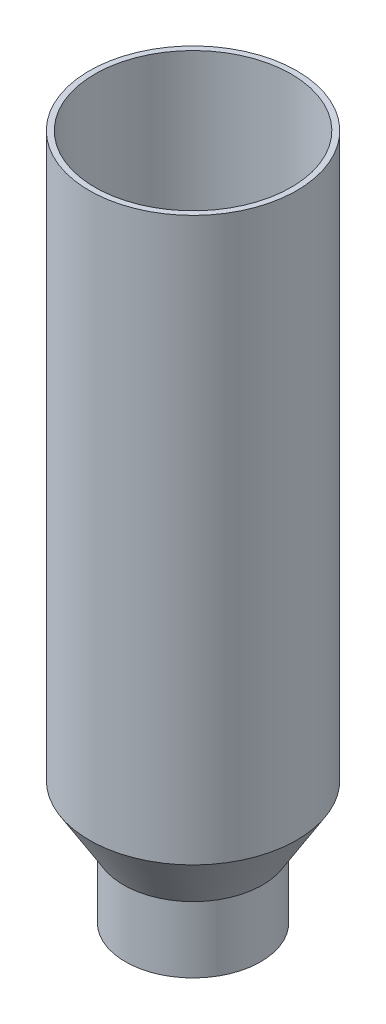
ISO-10303-21;
HEADER;
FILE_DESCRIPTION(('STEP AP214'),'2;1');
FILE_NAME('part.step','',(''),(''),'','','');
FILE_SCHEMA(('AUTOMOTIVE_DESIGN { 1 0 10303 214 1 1 1 1 }'));
ENDSEC;
DATA;
#1=APPLICATION_CONTEXT('core data for automotive mechanical design processes');
#2=APPLICATION_PROTOCOL_DEFINITION('international standard','automotive_design',2000,#1);
#3=PRODUCT_CONTEXT('',#1,'mechanical');
#4=PRODUCT('Part','Part','',(#3));
#5=PRODUCT_RELATED_PRODUCT_CATEGORY('part','',(#4));
#6=PRODUCT_DEFINITION_FORMATION('','',#4);
#7=PRODUCT_DEFINITION_CONTEXT('part definition',#1,'design');
#8=PRODUCT_DEFINITION('design','',#6,#7);
#9=PRODUCT_DEFINITION_SHAPE('','',#8);
#10=(LENGTH_UNIT() NAMED_UNIT(*) SI_UNIT(.MILLI.,.METRE.));
#11=(NAMED_UNIT(*) PLANE_ANGLE_UNIT() SI_UNIT($,.RADIAN.));
#12=(NAMED_UNIT(*) SI_UNIT($,.STERADIAN.) SOLID_ANGLE_UNIT());
#13=UNCERTAINTY_MEASURE_WITH_UNIT(LENGTH_MEASURE(1.E-05),#10,'distance_accuracy_value','');
#14=(GEOMETRIC_REPRESENTATION_CONTEXT(3) GLOBAL_UNCERTAINTY_ASSIGNED_CONTEXT((#13)) GLOBAL_UNIT_ASSIGNED_CONTEXT((#10,
#11,#12)) REPRESENTATION_CONTEXT('',''));
#15=CARTESIAN_POINT('',(0.,0.,0.));
#16=DIRECTION('',(0.,0.,1.));
#17=DIRECTION('',(1.,0.,0.));
#18=AXIS2_PLACEMENT_3D('',#15,#16,#17);
#19=CARTESIAN_POINT('',(-11.065,0.,0.));
#20=DIRECTION('',(0.,1.,0.));
#21=DIRECTION('',(0.,0.,1.));
#22=AXIS2_PLACEMENT_3D('',#19,#20,#21);
#23=PLANE('',#22);
#24=CARTESIAN_POINT('',(0.,0.,0.));
#25=DIRECTION('',(0.,-1.,0.));
#26=DIRECTION('',(0.,0.,-1.));
#27=AXIS2_PLACEMENT_3D('',#24,#25,#26);
#28=CIRCLE('',#27,11.065);
#29=CARTESIAN_POINT('',(0.,0.,-11.065));
#30=VERTEX_POINT('',#29);
#31=EDGE_CURVE('E68',#30,#30,#28,.T.);
#32=ORIENTED_EDGE('',*,*,#31,.F.);
#33=EDGE_LOOP('',(#32));
#34=FACE_BOUND('',#33,.T.);
#35=CARTESIAN_POINT('',(0.,0.,0.));
#36=DIRECTION('',(0.,-1.,0.));
#37=DIRECTION('',(0.,0.,-1.));
#38=AXIS2_PLACEMENT_3D('',#35,#36,#37);
#39=CIRCLE('',#38,12.065);
#40=CARTESIAN_POINT('',(0.,0.,-12.065));
#41=VERTEX_POINT('',#40);
#42=EDGE_CURVE('E10',#41,#41,#39,.T.);
#43=ORIENTED_EDGE('',*,*,#42,.T.);
#44=EDGE_LOOP('',(#43));
#45=FACE_BOUND('',#44,.T.);
#46=ADVANCED_FACE('F34',(#34,#45),#23,.F.);
#47=CARTESIAN_POINT('',(0.,0.,0.));
#48=DIRECTION('',(0.,-1.,0.));
#49=DIRECTION('',(0.,0.,-1.));
#50=AXIS2_PLACEMENT_3D('',#47,#48,#49);
#51=CYLINDRICAL_SURFACE('',#50,12.065);
#52=ORIENTED_EDGE('',*,*,#42,.F.);
#53=EDGE_LOOP('',(#52));
#54=FACE_BOUND('',#53,.T.);
#55=CARTESIAN_POINT('',(0.,12.,0.));
#56=DIRECTION('',(0.,-1.,0.));
#57=DIRECTION('',(0.,0.,-1.));
#58=AXIS2_PLACEMENT_3D('',#55,#56,#57);
#59=CIRCLE('',#58,12.065);
#60=CARTESIAN_POINT('',(0.,12.,-12.065));
#61=VERTEX_POINT('',#60);
#62=EDGE_CURVE('E40',#61,#61,#59,.T.);
#63=ORIENTED_EDGE('',*,*,#62,.T.);
#64=EDGE_LOOP('',(#63));
#65=FACE_BOUND('',#64,.T.);
#66=ADVANCED_FACE('F75',(#54,#65),#51,.T.);
#67=CARTESIAN_POINT('',(-12.065,12.,0.));
#68=DIRECTION('',(0.,1.,0.));
#69=DIRECTION('',(0.,0.,1.));
#70=AXIS2_PLACEMENT_3D('',#67,#68,#69);
#71=PLANE('',#70);
#72=ORIENTED_EDGE('',*,*,#62,.F.);
#73=EDGE_LOOP('',(#72));
#74=FACE_BOUND('',#73,.T.);
#75=CARTESIAN_POINT('',(0.,12.,0.));
#76=DIRECTION('',(0.,-1.,0.));
#77=DIRECTION('',(0.,0.,-1.));
#78=AXIS2_PLACEMENT_3D('',#75,#76,#77);
#79=CIRCLE('',#78,12.369);
#80=CARTESIAN_POINT('',(0.,12.,-12.369));
#81=VERTEX_POINT('',#80);
#82=EDGE_CURVE('E44',#81,#81,#79,.T.);
#83=ORIENTED_EDGE('',*,*,#82,.T.);
#84=EDGE_LOOP('',(#83));
#85=FACE_BOUND('',#84,.T.);
#86=ADVANCED_FACE('F79',(#74,#85),#71,.F.);
#87=CARTESIAN_POINT('',(0.,22.,0.));
#88=DIRECTION('',(0.,1.,0.));
#89=DIRECTION('',(0.,0.,1.));
#90=AXIS2_PLACEMENT_3D('',#87,#88,#89);
#91=CONICAL_SURFACE('',#90,18.5,0.549996210983491);
#92=ORIENTED_EDGE('',*,*,#82,.F.);
#93=EDGE_LOOP('',(#92));
#94=FACE_BOUND('',#93,.T.);
#95=CARTESIAN_POINT('',(0.,22.,0.));
#96=DIRECTION('',(0.,-1.,0.));
#97=DIRECTION('',(0.,0.,-1.));
#98=AXIS2_PLACEMENT_3D('',#95,#96,#97);
#99=CIRCLE('',#98,18.5);
#100=CARTESIAN_POINT('',(0.,22.,-18.5));
#101=VERTEX_POINT('',#100);
#102=EDGE_CURVE('E48',#101,#101,#99,.T.);
#103=ORIENTED_EDGE('',*,*,#102,.T.);
#104=EDGE_LOOP('',(#103));
#105=FACE_BOUND('',#104,.T.);
#106=ADVANCED_FACE('F84',(#94,#105),#91,.T.);
#107=CARTESIAN_POINT('',(0.,0.,0.));
#108=DIRECTION('',(0.,-1.,0.));
#109=DIRECTION('',(0.,0.,-1.));
#110=AXIS2_PLACEMENT_3D('',#107,#108,#109);
#111=CYLINDRICAL_SURFACE('',#110,18.5);
#112=ORIENTED_EDGE('',*,*,#102,.F.);
#113=EDGE_LOOP('',(#112));
#114=FACE_BOUND('',#113,.T.);
#115=CARTESIAN_POINT('',(0.,122.282146570095,0.));
#116=DIRECTION('',(0.,-1.,0.));
#117=DIRECTION('',(0.,0.,-1.));
#118=AXIS2_PLACEMENT_3D('',#115,#116,#117);
#119=CIRCLE('',#118,18.5);
#120=CARTESIAN_POINT('',(0.,122.282146570095,-18.5));
#121=VERTEX_POINT('',#120);
#122=EDGE_CURVE('E53',#121,#121,#119,.T.);
#123=ORIENTED_EDGE('',*,*,#122,.T.);
#124=EDGE_LOOP('',(#123));
#125=FACE_BOUND('',#124,.T.);
#126=ADVANCED_FACE('F90',(#114,#125),#111,.T.);
#127=CARTESIAN_POINT('',(-18.5,122.282146570095,0.));
#128=DIRECTION('',(0.,-1.,0.));
#129=DIRECTION('',(0.,0.,-1.));
#130=AXIS2_PLACEMENT_3D('',#127,#128,#129);
#131=PLANE('',#130);
#132=ORIENTED_EDGE('',*,*,#122,.F.);
#133=EDGE_LOOP('',(#132));
#134=FACE_BOUND('',#133,.T.);
#135=CARTESIAN_POINT('',(0.,122.282146570095,0.));
#136=DIRECTION('',(0.,-1.,0.));
#137=DIRECTION('',(0.,0.,-1.));
#138=AXIS2_PLACEMENT_3D('',#135,#136,#137);
#139=CIRCLE('',#138,17.5);
#140=CARTESIAN_POINT('',(0.,122.282146570095,-17.5));
#141=VERTEX_POINT('',#140);
#142=EDGE_CURVE('E56',#141,#141,#139,.T.);
#143=ORIENTED_EDGE('',*,*,#142,.T.);
#144=EDGE_LOOP('',(#143));
#145=FACE_BOUND('',#144,.T.);
#146=ADVANCED_FACE('F94',(#134,#145),#131,.F.);
#147=CARTESIAN_POINT('',(0.,0.,0.));
#148=DIRECTION('',(0.,-1.,0.));
#149=DIRECTION('',(0.,0.,-1.));
#150=AXIS2_PLACEMENT_3D('',#147,#148,#149);
#151=CYLINDRICAL_SURFACE('',#150,17.5);
#152=ORIENTED_EDGE('',*,*,#142,.F.);
#153=EDGE_LOOP('',(#152));
#154=FACE_BOUND('',#153,.T.);
#155=CARTESIAN_POINT('',(0.,22.2821465700951,0.));
#156=DIRECTION('',(0.,-1.,0.));
#157=DIRECTION('',(0.,0.,-1.));
#158=AXIS2_PLACEMENT_3D('',#155,#156,#157);
#159=CIRCLE('',#158,17.5);
#160=CARTESIAN_POINT('',(0.,22.2821465700951,-17.5));
#161=VERTEX_POINT('',#160);
#162=EDGE_CURVE('E59',#161,#161,#159,.T.);
#163=ORIENTED_EDGE('',*,*,#162,.T.);
#164=EDGE_LOOP('',(#163));
#165=FACE_BOUND('',#164,.T.);
#166=ADVANCED_FACE('F98',(#154,#165),#151,.F.);
#167=CARTESIAN_POINT('',(0.,13.,0.));
#168=DIRECTION('',(0.,1.,0.));
#169=DIRECTION('',(0.,0.,1.));
#170=AXIS2_PLACEMENT_3D('',#167,#168,#169);
#171=CONICAL_SURFACE('',#170,11.8091159378747,0.549996210983491);
#172=ORIENTED_EDGE('',*,*,#162,.F.);
#173=EDGE_LOOP('',(#172));
#174=FACE_BOUND('',#173,.T.);
#175=CARTESIAN_POINT('',(0.,13.,0.));
#176=DIRECTION('',(0.,-1.,0.));
#177=DIRECTION('',(0.,0.,-1.));
#178=AXIS2_PLACEMENT_3D('',#175,#176,#177);
#179=CIRCLE('',#178,11.8091159378747);
#180=CARTESIAN_POINT('',(0.,13.,-11.8091159378747));
#181=VERTEX_POINT('',#180);
#182=EDGE_CURVE('E62',#181,#181,#179,.T.);
#183=ORIENTED_EDGE('',*,*,#182,.T.);
#184=EDGE_LOOP('',(#183));
#185=FACE_BOUND('',#184,.T.);
#186=ADVANCED_FACE('F102',(#174,#185),#171,.F.);
#187=CARTESIAN_POINT('',(-11.8091159378747,13.,0.));
#188=DIRECTION('',(0.,-1.,0.));
#189=DIRECTION('',(0.,0.,-1.));
#190=AXIS2_PLACEMENT_3D('',#187,#188,#189);
#191=PLANE('',#190);
#192=ORIENTED_EDGE('',*,*,#182,.F.);
#193=EDGE_LOOP('',(#192));
#194=FACE_BOUND('',#193,.T.);
#195=CARTESIAN_POINT('',(0.,13.,0.));
#196=DIRECTION('',(0.,-1.,0.));
#197=DIRECTION('',(0.,0.,-1.));
#198=AXIS2_PLACEMENT_3D('',#195,#196,#197);
#199=CIRCLE('',#198,11.065);
#200=CARTESIAN_POINT('',(0.,13.,-11.065));
#201=VERTEX_POINT('',#200);
#202=EDGE_CURVE('E65',#201,#201,#199,.T.);
#203=ORIENTED_EDGE('',*,*,#202,.T.);
#204=EDGE_LOOP('',(#203));
#205=FACE_BOUND('',#204,.T.);
#206=ADVANCED_FACE('F106',(#194,#205),#191,.F.);
#207=CARTESIAN_POINT('',(0.,0.,0.));
#208=DIRECTION('',(0.,-1.,0.));
#209=DIRECTION('',(0.,0.,-1.));
#210=AXIS2_PLACEMENT_3D('',#207,#208,#209);
#211=CYLINDRICAL_SURFACE('',#210,11.065);
#212=ORIENTED_EDGE('',*,*,#202,.F.);
#213=EDGE_LOOP('',(#212));
#214=FACE_BOUND('',#213,.T.);
#215=ORIENTED_EDGE('',*,*,#31,.T.);
#216=EDGE_LOOP('',(#215));
#217=FACE_BOUND('',#216,.T.);
#218=ADVANCED_FACE('F72',(#214,#217),#211,.F.);
#219=CLOSED_SHELL('',(#46,#66,#86,#106,#126,#146,#166,#186,#206,#218));
#220=MANIFOLD_SOLID_BREP('B2',#219);
#221=ADVANCED_BREP_SHAPE_REPRESENTATION('',(#18,#220),#14);
#222=SHAPE_DEFINITION_REPRESENTATION(#9,#221);
ENDSEC;
END-ISO-10303-21;
